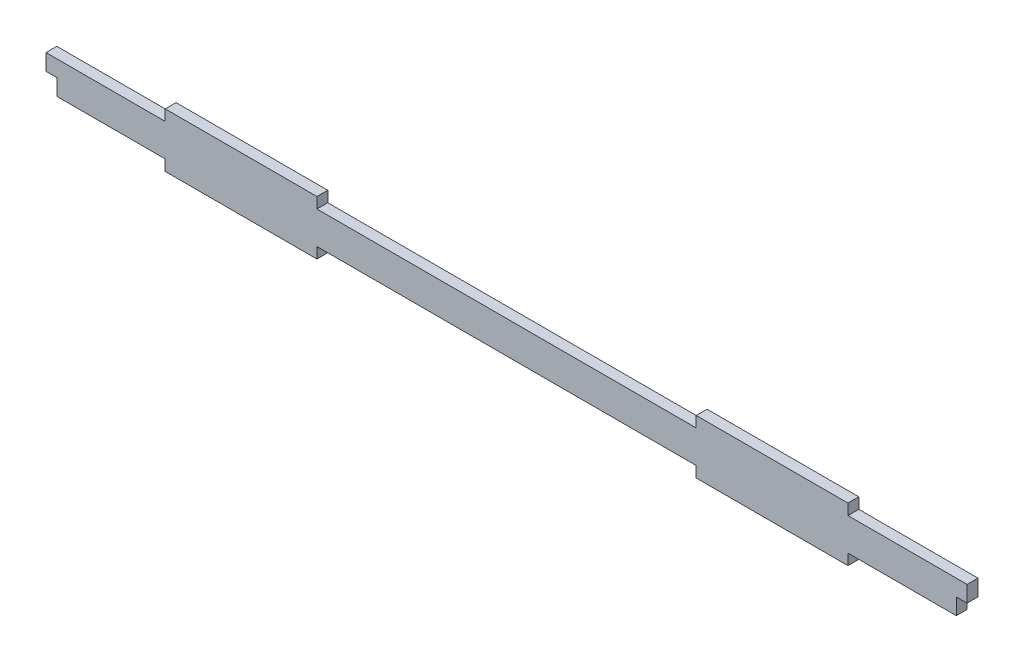
ISO-10303-21;
HEADER;
FILE_DESCRIPTION(('STEP AP214'),'2;1');
FILE_NAME('part.step','',(''),(''),'','','');
FILE_SCHEMA(('AUTOMOTIVE_DESIGN { 1 0 10303 214 1 1 1 1 }'));
ENDSEC;
DATA;
#1=APPLICATION_CONTEXT('core data for automotive mechanical design processes');
#2=APPLICATION_PROTOCOL_DEFINITION('international standard','automotive_design',2000,#1);
#3=PRODUCT_CONTEXT('',#1,'mechanical');
#4=PRODUCT('Part','Part','',(#3));
#5=PRODUCT_RELATED_PRODUCT_CATEGORY('part','',(#4));
#6=PRODUCT_DEFINITION_FORMATION('','',#4);
#7=PRODUCT_DEFINITION_CONTEXT('part definition',#1,'design');
#8=PRODUCT_DEFINITION('design','',#6,#7);
#9=PRODUCT_DEFINITION_SHAPE('','',#8);
#10=(LENGTH_UNIT() NAMED_UNIT(*) SI_UNIT(.MILLI.,.METRE.));
#11=(NAMED_UNIT(*) PLANE_ANGLE_UNIT() SI_UNIT($,.RADIAN.));
#12=(NAMED_UNIT(*) SI_UNIT($,.STERADIAN.) SOLID_ANGLE_UNIT());
#13=UNCERTAINTY_MEASURE_WITH_UNIT(LENGTH_MEASURE(1.E-05),#10,'distance_accuracy_value','');
#14=(GEOMETRIC_REPRESENTATION_CONTEXT(3) GLOBAL_UNCERTAINTY_ASSIGNED_CONTEXT((#13)) GLOBAL_UNIT_ASSIGNED_CONTEXT((#10,
#11,#12)) REPRESENTATION_CONTEXT('',''));
#15=CARTESIAN_POINT('',(0.,0.,0.));
#16=DIRECTION('',(0.,0.,1.));
#17=DIRECTION('',(1.,0.,0.));
#18=AXIS2_PLACEMENT_3D('',#15,#16,#17);
#19=CARTESIAN_POINT('',(0.,0.,5.));
#20=DIRECTION('',(0.,1.,0.));
#21=DIRECTION('',(-1.,0.,0.));
#22=AXIS2_PLACEMENT_3D('',#19,#20,#21);
#23=PLANE('',#22);
#24=DIRECTION('',(1.,0.,0.));
#25=VECTOR('',#24,1.);
#26=CARTESIAN_POINT('',(0.,0.,5.));
#27=LINE('',#26,#25);
#28=CARTESIAN_POINT('',(-50.,0.,5.));
#29=VERTEX_POINT('',#28);
#30=CARTESIAN_POINT('',(0.,0.,5.));
#31=VERTEX_POINT('',#30);
#32=EDGE_CURVE('E47',#29,#31,#27,.T.);
#33=ORIENTED_EDGE('',*,*,#32,.F.);
#34=DIRECTION('',(0.,0.,1.));
#35=VECTOR('',#34,1.);
#36=CARTESIAN_POINT('',(-50.,-1.04083408558608E-13,0.));
#37=LINE('',#36,#35);
#38=CARTESIAN_POINT('',(-50.,-1.04083408558608E-13,0.));
#39=VERTEX_POINT('',#38);
#40=EDGE_CURVE('E227',#39,#29,#37,.T.);
#41=ORIENTED_EDGE('',*,*,#40,.F.);
#42=DIRECTION('',(1.,0.,0.));
#43=VECTOR('',#42,1.);
#44=CARTESIAN_POINT('',(0.,0.,0.));
#45=LINE('',#44,#43);
#46=CARTESIAN_POINT('',(0.,0.,0.));
#47=VERTEX_POINT('',#46);
#48=EDGE_CURVE('E374',#39,#47,#45,.T.);
#49=ORIENTED_EDGE('',*,*,#48,.T.);
#50=DIRECTION('',(0.,0.,-1.));
#51=VECTOR('',#50,1.);
#52=CARTESIAN_POINT('',(0.,0.,5.));
#53=LINE('',#52,#51);
#54=EDGE_CURVE('E40',#31,#47,#53,.T.);
#55=ORIENTED_EDGE('',*,*,#54,.F.);
#56=EDGE_LOOP('',(#33,#41,#49,#55));
#57=FACE_BOUND('',#56,.T.);
#58=ADVANCED_FACE('F32',(#57),#23,.F.);
#59=CARTESIAN_POINT('',(-295.,-1.04083408558608E-13,0.));
#60=VERTEX_POINT('',#59);
#61=CARTESIAN_POINT('',(-120.,0.,0.));
#62=VERTEX_POINT('',#61);
#63=EDGE_CURVE('E376',#60,#62,#45,.T.);
#64=ORIENTED_EDGE('',*,*,#63,.T.);
#65=DIRECTION('',(0.,0.,1.));
#66=VECTOR('',#65,1.);
#67=CARTESIAN_POINT('',(-120.,-1.04083408558608E-13,0.));
#68=LINE('',#67,#66);
#69=CARTESIAN_POINT('',(-120.,0.,5.));
#70=VERTEX_POINT('',#69);
#71=EDGE_CURVE('E55',#62,#70,#68,.T.);
#72=ORIENTED_EDGE('',*,*,#71,.T.);
#73=CARTESIAN_POINT('',(-295.,-1.04083408558608E-13,5.));
#74=VERTEX_POINT('',#73);
#75=EDGE_CURVE('E365',#74,#70,#27,.T.);
#76=ORIENTED_EDGE('',*,*,#75,.F.);
#77=DIRECTION('',(0.,0.,1.));
#78=VECTOR('',#77,1.);
#79=CARTESIAN_POINT('',(-295.,-1.04083408558608E-13,0.));
#80=LINE('',#79,#78);
#81=EDGE_CURVE('E253',#60,#74,#80,.T.);
#82=ORIENTED_EDGE('',*,*,#81,.F.);
#83=EDGE_LOOP('',(#64,#72,#76,#82));
#84=FACE_BOUND('',#83,.T.);
#85=ADVANCED_FACE('F390',(#84),#23,.F.);
#86=CARTESIAN_POINT('',(0.,15.,5.));
#87=DIRECTION('',(0.,-1.,0.));
#88=DIRECTION('',(1.,0.,0.));
#89=AXIS2_PLACEMENT_3D('',#86,#87,#88);
#90=PLANE('',#89);
#91=DIRECTION('',(-1.,0.,0.));
#92=VECTOR('',#91,1.);
#93=CARTESIAN_POINT('',(0.,15.,0.));
#94=LINE('',#93,#92);
#95=CARTESIAN_POINT('',(5.,14.9999999999999,0.));
#96=VERTEX_POINT('',#95);
#97=CARTESIAN_POINT('',(-50.,15.,0.));
#98=VERTEX_POINT('',#97);
#99=EDGE_CURVE('E369',#96,#98,#94,.T.);
#100=ORIENTED_EDGE('',*,*,#99,.T.);
#101=DIRECTION('',(0.,0.,1.));
#102=VECTOR('',#101,1.);
#103=CARTESIAN_POINT('',(-50.,15.,0.));
#104=LINE('',#103,#102);
#105=CARTESIAN_POINT('',(-50.,15.,5.));
#106=VERTEX_POINT('',#105);
#107=EDGE_CURVE('E276',#98,#106,#104,.T.);
#108=ORIENTED_EDGE('',*,*,#107,.T.);
#109=DIRECTION('',(-1.,0.,0.));
#110=VECTOR('',#109,1.);
#111=CARTESIAN_POINT('',(0.,15.,5.));
#112=LINE('',#111,#110);
#113=CARTESIAN_POINT('',(5.,14.9999999999999,5.));
#114=VERTEX_POINT('',#113);
#115=EDGE_CURVE('E356',#114,#106,#112,.T.);
#116=ORIENTED_EDGE('',*,*,#115,.F.);
#117=DIRECTION('',(0.,0.,1.));
#118=VECTOR('',#117,1.);
#119=CARTESIAN_POINT('',(5.,14.9999999999999,0.));
#120=LINE('',#119,#118);
#121=EDGE_CURVE('E323',#96,#114,#120,.T.);
#122=ORIENTED_EDGE('',*,*,#121,.F.);
#123=EDGE_LOOP('',(#100,#108,#116,#122));
#124=FACE_BOUND('',#123,.T.);
#125=ADVANCED_FACE('F413',(#124),#90,.F.);
#126=DIRECTION('',(0.,0.,1.));
#127=VECTOR('',#126,1.);
#128=CARTESIAN_POINT('',(-365.,15.,0.));
#129=LINE('',#128,#127);
#130=CARTESIAN_POINT('',(-365.,15.,0.));
#131=VERTEX_POINT('',#130);
#132=CARTESIAN_POINT('',(-365.,15.,5.));
#133=VERTEX_POINT('',#132);
#134=EDGE_CURVE('E294',#131,#133,#129,.T.);
#135=ORIENTED_EDGE('',*,*,#134,.F.);
#136=CARTESIAN_POINT('',(-420.,14.9999999999999,0.));
#137=VERTEX_POINT('',#136);
#138=EDGE_CURVE('E368',#131,#137,#94,.T.);
#139=ORIENTED_EDGE('',*,*,#138,.T.);
#140=DIRECTION('',(0.,0.,1.));
#141=VECTOR('',#140,1.);
#142=CARTESIAN_POINT('',(-420.,14.9999999999999,0.));
#143=LINE('',#142,#141);
#144=CARTESIAN_POINT('',(-420.,14.9999999999999,5.));
#145=VERTEX_POINT('',#144);
#146=EDGE_CURVE('E338',#137,#145,#143,.T.);
#147=ORIENTED_EDGE('',*,*,#146,.T.);
#148=EDGE_CURVE('E354',#133,#145,#112,.T.);
#149=ORIENTED_EDGE('',*,*,#148,.F.);
#150=EDGE_LOOP('',(#135,#139,#147,#149));
#151=FACE_BOUND('',#150,.T.);
#152=ADVANCED_FACE('F425',(#151),#90,.F.);
#153=CARTESIAN_POINT('',(-415.,0.,5.));
#154=DIRECTION('',(1.,0.,0.));
#155=DIRECTION('',(0.,0.,-1.));
#156=AXIS2_PLACEMENT_3D('',#153,#154,#155);
#157=PLANE('',#156);
#158=DIRECTION('',(0.,0.,1.));
#159=VECTOR('',#158,1.);
#160=CARTESIAN_POINT('',(-415.,7.49999999999995,0.));
#161=LINE('',#160,#159);
#162=CARTESIAN_POINT('',(-415.,7.49999999999995,0.));
#163=VERTEX_POINT('',#162);
#164=CARTESIAN_POINT('',(-415.,7.49999999999995,5.));
#165=VERTEX_POINT('',#164);
#166=EDGE_CURVE('E343',#163,#165,#161,.T.);
#167=ORIENTED_EDGE('',*,*,#166,.F.);
#168=DIRECTION('',(0.,-1.,0.));
#169=VECTOR('',#168,1.);
#170=CARTESIAN_POINT('',(-415.,0.,0.));
#171=LINE('',#170,#169);
#172=CARTESIAN_POINT('',(-415.,0.,0.));
#173=VERTEX_POINT('',#172);
#174=EDGE_CURVE('E371',#163,#173,#171,.T.);
#175=ORIENTED_EDGE('',*,*,#174,.T.);
#176=DIRECTION('',(0.,0.,-1.));
#177=VECTOR('',#176,1.);
#178=CARTESIAN_POINT('',(-415.,0.,5.));
#179=LINE('',#178,#177);
#180=CARTESIAN_POINT('',(-415.,0.,5.));
#181=VERTEX_POINT('',#180);
#182=EDGE_CURVE('E11',#181,#173,#179,.T.);
#183=ORIENTED_EDGE('',*,*,#182,.F.);
#184=DIRECTION('',(0.,-1.,0.));
#185=VECTOR('',#184,1.);
#186=CARTESIAN_POINT('',(-415.,0.,5.));
#187=LINE('',#186,#185);
#188=EDGE_CURVE('E359',#165,#181,#187,.T.);
#189=ORIENTED_EDGE('',*,*,#188,.F.);
#190=EDGE_LOOP('',(#167,#175,#183,#189));
#191=FACE_BOUND('',#190,.T.);
#192=ADVANCED_FACE('F437',(#191),#157,.F.);
#193=CARTESIAN_POINT('',(0.,0.,5.));
#194=DIRECTION('',(-1.,0.,0.));
#195=DIRECTION('',(0.,0.,1.));
#196=AXIS2_PLACEMENT_3D('',#193,#194,#195);
#197=PLANE('',#196);
#198=DIRECTION('',(0.,1.,0.));
#199=VECTOR('',#198,1.);
#200=CARTESIAN_POINT('',(0.,0.,0.));
#201=LINE('',#200,#199);
#202=CARTESIAN_POINT('',(0.,7.49999999999995,0.));
#203=VERTEX_POINT('',#202);
#204=EDGE_CURVE('E346',#47,#203,#201,.T.);
#205=ORIENTED_EDGE('',*,*,#204,.T.);
#206=DIRECTION('',(0.,0.,1.));
#207=VECTOR('',#206,1.);
#208=CARTESIAN_POINT('',(0.,7.49999999999995,0.));
#209=LINE('',#208,#207);
#210=CARTESIAN_POINT('',(0.,7.49999999999995,5.));
#211=VERTEX_POINT('',#210);
#212=EDGE_CURVE('E318',#203,#211,#209,.T.);
#213=ORIENTED_EDGE('',*,*,#212,.T.);
#214=DIRECTION('',(0.,1.,0.));
#215=VECTOR('',#214,1.);
#216=CARTESIAN_POINT('',(0.,0.,5.));
#217=LINE('',#216,#215);
#218=EDGE_CURVE('E351',#31,#211,#217,.T.);
#219=ORIENTED_EDGE('',*,*,#218,.F.);
#220=ORIENTED_EDGE('',*,*,#54,.T.);
#221=EDGE_LOOP('',(#205,#213,#219,#220));
#222=FACE_BOUND('',#221,.T.);
#223=ADVANCED_FACE('F34',(#222),#197,.F.);
#224=CARTESIAN_POINT('',(-120.,15.,5.));
#225=VERTEX_POINT('',#224);
#226=CARTESIAN_POINT('',(-295.,15.,5.));
#227=VERTEX_POINT('',#226);
#228=EDGE_CURVE('E360',#225,#227,#112,.T.);
#229=ORIENTED_EDGE('',*,*,#228,.F.);
#230=DIRECTION('',(0.,0.,1.));
#231=VECTOR('',#230,1.);
#232=CARTESIAN_POINT('',(-120.,15.,0.));
#233=LINE('',#232,#231);
#234=CARTESIAN_POINT('',(-120.,15.,0.));
#235=VERTEX_POINT('',#234);
#236=EDGE_CURVE('E279',#235,#225,#233,.T.);
#237=ORIENTED_EDGE('',*,*,#236,.F.);
#238=CARTESIAN_POINT('',(-295.,15.,0.));
#239=VERTEX_POINT('',#238);
#240=EDGE_CURVE('E372',#235,#239,#94,.T.);
#241=ORIENTED_EDGE('',*,*,#240,.T.);
#242=DIRECTION('',(0.,0.,1.));
#243=VECTOR('',#242,1.);
#244=CARTESIAN_POINT('',(-295.,15.,0.));
#245=LINE('',#244,#243);
#246=EDGE_CURVE('E307',#239,#227,#245,.T.);
#247=ORIENTED_EDGE('',*,*,#246,.T.);
#248=EDGE_LOOP('',(#229,#237,#241,#247));
#249=FACE_BOUND('',#248,.T.);
#250=ADVANCED_FACE('F417',(#249),#90,.F.);
#251=CARTESIAN_POINT('',(-365.,-1.04083408558608E-13,0.));
#252=VERTEX_POINT('',#251);
#253=EDGE_CURVE('E355',#173,#252,#45,.T.);
#254=ORIENTED_EDGE('',*,*,#253,.T.);
#255=DIRECTION('',(0.,0.,1.));
#256=VECTOR('',#255,1.);
#257=CARTESIAN_POINT('',(-365.,-1.04083408558608E-13,0.));
#258=LINE('',#257,#256);
#259=CARTESIAN_POINT('',(-365.,0.,5.));
#260=VERTEX_POINT('',#259);
#261=EDGE_CURVE('E249',#252,#260,#258,.T.);
#262=ORIENTED_EDGE('',*,*,#261,.T.);
#263=EDGE_CURVE('E362',#181,#260,#27,.T.);
#264=ORIENTED_EDGE('',*,*,#263,.F.);
#265=ORIENTED_EDGE('',*,*,#182,.T.);
#266=EDGE_LOOP('',(#254,#262,#264,#265));
#267=FACE_BOUND('',#266,.T.);
#268=ADVANCED_FACE('F409',(#267),#23,.F.);
#269=CARTESIAN_POINT('',(0.,0.,5.));
#270=DIRECTION('',(0.,0.,1.));
#271=DIRECTION('',(1.,0.,0.));
#272=AXIS2_PLACEMENT_3D('',#269,#270,#271);
#273=PLANE('',#272);
#274=ORIENTED_EDGE('',*,*,#218,.T.);
#275=DIRECTION('',(1.,0.,0.));
#276=VECTOR('',#275,1.);
#277=CARTESIAN_POINT('',(0.,7.49999999999995,5.));
#278=LINE('',#277,#276);
#279=CARTESIAN_POINT('',(5.,7.49999999999995,5.));
#280=VERTEX_POINT('',#279);
#281=EDGE_CURVE('E304',#211,#280,#278,.T.);
#282=ORIENTED_EDGE('',*,*,#281,.T.);
#283=DIRECTION('',(0.,1.,0.));
#284=VECTOR('',#283,1.);
#285=CARTESIAN_POINT('',(5.,14.9999999999999,5.));
#286=LINE('',#285,#284);
#287=EDGE_CURVE('E315',#280,#114,#286,.T.);
#288=ORIENTED_EDGE('',*,*,#287,.T.);
#289=ORIENTED_EDGE('',*,*,#115,.T.);
#290=DIRECTION('',(0.,1.,0.));
#291=VECTOR('',#290,1.);
#292=CARTESIAN_POINT('',(-50.,15.,5.));
#293=LINE('',#292,#291);
#294=CARTESIAN_POINT('',(-50.,20.,5.));
#295=VERTEX_POINT('',#294);
#296=EDGE_CURVE('E252',#106,#295,#293,.T.);
#297=ORIENTED_EDGE('',*,*,#296,.T.);
#298=DIRECTION('',(-1.,0.,0.));
#299=VECTOR('',#298,1.);
#300=CARTESIAN_POINT('',(-50.,20.,5.));
#301=LINE('',#300,#299);
#302=CARTESIAN_POINT('',(-120.,20.,5.));
#303=VERTEX_POINT('',#302);
#304=EDGE_CURVE('E271',#295,#303,#301,.T.);
#305=ORIENTED_EDGE('',*,*,#304,.T.);
#306=DIRECTION('',(0.,-1.,0.));
#307=VECTOR('',#306,1.);
#308=CARTESIAN_POINT('',(-120.,15.,5.));
#309=LINE('',#308,#307);
#310=EDGE_CURVE('E262',#303,#225,#309,.T.);
#311=ORIENTED_EDGE('',*,*,#310,.T.);
#312=ORIENTED_EDGE('',*,*,#228,.T.);
#313=DIRECTION('',(0.,1.,0.));
#314=VECTOR('',#313,1.);
#315=CARTESIAN_POINT('',(-295.,15.,5.));
#316=LINE('',#315,#314);
#317=CARTESIAN_POINT('',(-295.,20.,5.));
#318=VERTEX_POINT('',#317);
#319=EDGE_CURVE('E297',#227,#318,#316,.T.);
#320=ORIENTED_EDGE('',*,*,#319,.T.);
#321=DIRECTION('',(-1.,0.,0.));
#322=VECTOR('',#321,1.);
#323=CARTESIAN_POINT('',(-365.,20.,5.));
#324=LINE('',#323,#322);
#325=CARTESIAN_POINT('',(-365.,20.,5.));
#326=VERTEX_POINT('',#325);
#327=EDGE_CURVE('E288',#318,#326,#324,.T.);
#328=ORIENTED_EDGE('',*,*,#327,.T.);
#329=DIRECTION('',(0.,-1.,0.));
#330=VECTOR('',#329,1.);
#331=CARTESIAN_POINT('',(-365.,15.,5.));
#332=LINE('',#331,#330);
#333=EDGE_CURVE('E278',#326,#133,#332,.T.);
#334=ORIENTED_EDGE('',*,*,#333,.T.);
#335=ORIENTED_EDGE('',*,*,#148,.T.);
#336=DIRECTION('',(0.,-1.,0.));
#337=VECTOR('',#336,1.);
#338=CARTESIAN_POINT('',(-420.,14.9999999999999,5.));
#339=LINE('',#338,#337);
#340=CARTESIAN_POINT('',(-420.,7.49999999999995,5.));
#341=VERTEX_POINT('',#340);
#342=EDGE_CURVE('E326',#145,#341,#339,.T.);
#343=ORIENTED_EDGE('',*,*,#342,.T.);
#344=DIRECTION('',(1.,0.,0.));
#345=VECTOR('',#344,1.);
#346=CARTESIAN_POINT('',(-415.,7.49999999999995,5.));
#347=LINE('',#346,#345);
#348=EDGE_CURVE('E335',#341,#165,#347,.T.);
#349=ORIENTED_EDGE('',*,*,#348,.T.);
#350=ORIENTED_EDGE('',*,*,#188,.T.);
#351=ORIENTED_EDGE('',*,*,#263,.T.);
#352=DIRECTION('',(0.,-1.,0.));
#353=VECTOR('',#352,1.);
#354=CARTESIAN_POINT('',(-365.,-1.04083408558608E-13,5.));
#355=LINE('',#354,#353);
#356=CARTESIAN_POINT('',(-365.,-5.0000000000001,5.));
#357=VERTEX_POINT('',#356);
#358=EDGE_CURVE('E229',#260,#357,#355,.T.);
#359=ORIENTED_EDGE('',*,*,#358,.T.);
#360=DIRECTION('',(1.,0.,0.));
#361=VECTOR('',#360,1.);
#362=CARTESIAN_POINT('',(-365.,-5.0000000000001,5.));
#363=LINE('',#362,#361);
#364=CARTESIAN_POINT('',(-295.,-5.0000000000001,5.));
#365=VERTEX_POINT('',#364);
#366=EDGE_CURVE('E244',#357,#365,#363,.T.);
#367=ORIENTED_EDGE('',*,*,#366,.T.);
#368=DIRECTION('',(0.,1.,0.));
#369=VECTOR('',#368,1.);
#370=CARTESIAN_POINT('',(-295.,-1.04083408558608E-13,5.));
#371=LINE('',#370,#369);
#372=EDGE_CURVE('E236',#365,#74,#371,.T.);
#373=ORIENTED_EDGE('',*,*,#372,.T.);
#374=ORIENTED_EDGE('',*,*,#75,.T.);
#375=DIRECTION('',(0.,-1.,0.));
#376=VECTOR('',#375,1.);
#377=CARTESIAN_POINT('',(-120.,-1.04083408558608E-13,5.));
#378=LINE('',#377,#376);
#379=CARTESIAN_POINT('',(-120.,-5.0000000000001,5.));
#380=VERTEX_POINT('',#379);
#381=EDGE_CURVE('E224',#70,#380,#378,.T.);
#382=ORIENTED_EDGE('',*,*,#381,.T.);
#383=DIRECTION('',(1.,0.,0.));
#384=VECTOR('',#383,1.);
#385=CARTESIAN_POINT('',(-50.,-5.0000000000001,5.));
#386=LINE('',#385,#384);
#387=CARTESIAN_POINT('',(-50.,-5.0000000000001,5.));
#388=VERTEX_POINT('',#387);
#389=EDGE_CURVE('E201',#380,#388,#386,.T.);
#390=ORIENTED_EDGE('',*,*,#389,.T.);
#391=DIRECTION('',(0.,1.,0.));
#392=VECTOR('',#391,1.);
#393=CARTESIAN_POINT('',(-50.,-1.04083408558608E-13,5.));
#394=LINE('',#393,#392);
#395=EDGE_CURVE('E218',#388,#29,#394,.T.);
#396=ORIENTED_EDGE('',*,*,#395,.T.);
#397=ORIENTED_EDGE('',*,*,#32,.T.);
#398=EDGE_LOOP('',(#274,#282,#288,#289,#297,#305,#311,#312,#320,#328,#334,#335,#343,#349,#350,
#351,#359,#367,#373,#374,#382,#390,#396,#397));
#399=FACE_BOUND('',#398,.T.);
#400=ADVANCED_FACE('F385',(#399),#273,.T.);
#401=CARTESIAN_POINT('',(0.,0.,0.));
#402=DIRECTION('',(0.,0.,1.));
#403=DIRECTION('',(1.,0.,0.));
#404=AXIS2_PLACEMENT_3D('',#401,#402,#403);
#405=PLANE('',#404);
#406=ORIENTED_EDGE('',*,*,#204,.F.);
#407=ORIENTED_EDGE('',*,*,#48,.F.);
#408=DIRECTION('',(0.,1.,0.));
#409=VECTOR('',#408,1.);
#410=CARTESIAN_POINT('',(-50.,-1.04083408558608E-13,0.));
#411=LINE('',#410,#409);
#412=CARTESIAN_POINT('',(-50.,-5.0000000000001,0.));
#413=VERTEX_POINT('',#412);
#414=EDGE_CURVE('E215',#413,#39,#411,.T.);
#415=ORIENTED_EDGE('',*,*,#414,.F.);
#416=DIRECTION('',(1.,0.,0.));
#417=VECTOR('',#416,1.);
#418=CARTESIAN_POINT('',(-50.,-5.0000000000001,0.));
#419=LINE('',#418,#417);
#420=CARTESIAN_POINT('',(-120.,-5.0000000000001,0.));
#421=VERTEX_POINT('',#420);
#422=EDGE_CURVE('E198',#421,#413,#419,.T.);
#423=ORIENTED_EDGE('',*,*,#422,.F.);
#424=DIRECTION('',(0.,-1.,0.));
#425=VECTOR('',#424,1.);
#426=CARTESIAN_POINT('',(-120.,-1.04083408558608E-13,0.));
#427=LINE('',#426,#425);
#428=EDGE_CURVE('E213',#62,#421,#427,.T.);
#429=ORIENTED_EDGE('',*,*,#428,.F.);
#430=ORIENTED_EDGE('',*,*,#63,.F.);
#431=DIRECTION('',(0.,1.,0.));
#432=VECTOR('',#431,1.);
#433=CARTESIAN_POINT('',(-295.,-1.04083408558608E-13,0.));
#434=LINE('',#433,#432);
#435=CARTESIAN_POINT('',(-295.,-5.0000000000001,0.));
#436=VERTEX_POINT('',#435);
#437=EDGE_CURVE('E239',#436,#60,#434,.T.);
#438=ORIENTED_EDGE('',*,*,#437,.F.);
#439=DIRECTION('',(1.,0.,0.));
#440=VECTOR('',#439,1.);
#441=CARTESIAN_POINT('',(-365.,-5.0000000000001,0.));
#442=LINE('',#441,#440);
#443=CARTESIAN_POINT('',(-365.,-5.0000000000001,0.));
#444=VERTEX_POINT('',#443);
#445=EDGE_CURVE('E235',#444,#436,#442,.T.);
#446=ORIENTED_EDGE('',*,*,#445,.F.);
#447=DIRECTION('',(0.,-1.,0.));
#448=VECTOR('',#447,1.);
#449=CARTESIAN_POINT('',(-365.,-1.04083408558608E-13,0.));
#450=LINE('',#449,#448);
#451=EDGE_CURVE('E232',#252,#444,#450,.T.);
#452=ORIENTED_EDGE('',*,*,#451,.F.);
#453=ORIENTED_EDGE('',*,*,#253,.F.);
#454=ORIENTED_EDGE('',*,*,#174,.F.);
#455=DIRECTION('',(1.,0.,0.));
#456=VECTOR('',#455,1.);
#457=CARTESIAN_POINT('',(-415.,7.49999999999995,0.));
#458=LINE('',#457,#456);
#459=CARTESIAN_POINT('',(-420.,7.49999999999995,0.));
#460=VERTEX_POINT('',#459);
#461=EDGE_CURVE('E334',#460,#163,#458,.T.);
#462=ORIENTED_EDGE('',*,*,#461,.F.);
#463=DIRECTION('',(0.,-1.,0.));
#464=VECTOR('',#463,1.);
#465=CARTESIAN_POINT('',(-420.,14.9999999999999,0.));
#466=LINE('',#465,#464);
#467=EDGE_CURVE('E331',#137,#460,#466,.T.);
#468=ORIENTED_EDGE('',*,*,#467,.F.);
#469=ORIENTED_EDGE('',*,*,#138,.F.);
#470=DIRECTION('',(0.,-1.,0.));
#471=VECTOR('',#470,1.);
#472=CARTESIAN_POINT('',(-365.,15.,0.));
#473=LINE('',#472,#471);
#474=CARTESIAN_POINT('',(-365.,20.,0.));
#475=VERTEX_POINT('',#474);
#476=EDGE_CURVE('E285',#475,#131,#473,.T.);
#477=ORIENTED_EDGE('',*,*,#476,.F.);
#478=DIRECTION('',(-1.,0.,0.));
#479=VECTOR('',#478,1.);
#480=CARTESIAN_POINT('',(-365.,20.,0.));
#481=LINE('',#480,#479);
#482=CARTESIAN_POINT('',(-295.,20.,0.));
#483=VERTEX_POINT('',#482);
#484=EDGE_CURVE('E291',#483,#475,#481,.T.);
#485=ORIENTED_EDGE('',*,*,#484,.F.);
#486=DIRECTION('',(0.,1.,0.));
#487=VECTOR('',#486,1.);
#488=CARTESIAN_POINT('',(-295.,15.,0.));
#489=LINE('',#488,#487);
#490=EDGE_CURVE('E287',#239,#483,#489,.T.);
#491=ORIENTED_EDGE('',*,*,#490,.F.);
#492=ORIENTED_EDGE('',*,*,#240,.F.);
#493=DIRECTION('',(0.,-1.,0.));
#494=VECTOR('',#493,1.);
#495=CARTESIAN_POINT('',(-120.,15.,0.));
#496=LINE('',#495,#494);
#497=CARTESIAN_POINT('',(-120.,20.,0.));
#498=VERTEX_POINT('',#497);
#499=EDGE_CURVE('E265',#498,#235,#496,.T.);
#500=ORIENTED_EDGE('',*,*,#499,.F.);
#501=DIRECTION('',(-1.,0.,0.));
#502=VECTOR('',#501,1.);
#503=CARTESIAN_POINT('',(-50.,20.,0.));
#504=LINE('',#503,#502);
#505=CARTESIAN_POINT('',(-50.,20.,0.));
#506=VERTEX_POINT('',#505);
#507=EDGE_CURVE('E261',#506,#498,#504,.T.);
#508=ORIENTED_EDGE('',*,*,#507,.F.);
#509=DIRECTION('',(0.,1.,0.));
#510=VECTOR('',#509,1.);
#511=CARTESIAN_POINT('',(-50.,15.,0.));
#512=LINE('',#511,#510);
#513=EDGE_CURVE('E258',#98,#506,#512,.T.);
#514=ORIENTED_EDGE('',*,*,#513,.F.);
#515=ORIENTED_EDGE('',*,*,#99,.F.);
#516=DIRECTION('',(0.,1.,0.));
#517=VECTOR('',#516,1.);
#518=CARTESIAN_POINT('',(5.,14.9999999999999,0.));
#519=LINE('',#518,#517);
#520=CARTESIAN_POINT('',(5.,7.49999999999995,0.));
#521=VERTEX_POINT('',#520);
#522=EDGE_CURVE('E314',#521,#96,#519,.T.);
#523=ORIENTED_EDGE('',*,*,#522,.F.);
#524=DIRECTION('',(1.,0.,0.));
#525=VECTOR('',#524,1.);
#526=CARTESIAN_POINT('',(0.,7.49999999999995,0.));
#527=LINE('',#526,#525);
#528=EDGE_CURVE('E311',#203,#521,#527,.T.);
#529=ORIENTED_EDGE('',*,*,#528,.F.);
#530=EDGE_LOOP('',(#406,#407,#415,#423,#429,#430,#438,#446,#452,#453,#454,#462,#468,#469,#477,
#485,#491,#492,#500,#508,#514,#515,#523,#529));
#531=FACE_BOUND('',#530,.T.);
#532=ADVANCED_FACE('F211',(#531),#405,.F.);
#533=CARTESIAN_POINT('',(-415.,7.49999999999995,0.));
#534=DIRECTION('',(0.,-1.,0.));
#535=DIRECTION('',(1.,0.,0.));
#536=AXIS2_PLACEMENT_3D('',#533,#534,#535);
#537=PLANE('',#536);
#538=ORIENTED_EDGE('',*,*,#348,.F.);
#539=DIRECTION('',(0.,0.,1.));
#540=VECTOR('',#539,1.);
#541=CARTESIAN_POINT('',(-420.,7.49999999999995,0.));
#542=LINE('',#541,#540);
#543=EDGE_CURVE('E347',#460,#341,#542,.T.);
#544=ORIENTED_EDGE('',*,*,#543,.F.);
#545=ORIENTED_EDGE('',*,*,#461,.T.);
#546=ORIENTED_EDGE('',*,*,#166,.T.);
#547=EDGE_LOOP('',(#538,#544,#545,#546));
#548=FACE_BOUND('',#547,.T.);
#549=ADVANCED_FACE('F439',(#548),#537,.T.);
#550=CARTESIAN_POINT('',(-420.,14.9999999999999,0.));
#551=DIRECTION('',(-1.,0.,0.));
#552=DIRECTION('',(0.,0.,1.));
#553=AXIS2_PLACEMENT_3D('',#550,#551,#552);
#554=PLANE('',#553);
#555=ORIENTED_EDGE('',*,*,#342,.F.);
#556=ORIENTED_EDGE('',*,*,#146,.F.);
#557=ORIENTED_EDGE('',*,*,#467,.T.);
#558=ORIENTED_EDGE('',*,*,#543,.T.);
#559=EDGE_LOOP('',(#555,#556,#557,#558));
#560=FACE_BOUND('',#559,.T.);
#561=ADVANCED_FACE('F446',(#560),#554,.T.);
#562=CARTESIAN_POINT('',(5.,14.9999999999999,0.));
#563=DIRECTION('',(1.,0.,0.));
#564=DIRECTION('',(0.,0.,-1.));
#565=AXIS2_PLACEMENT_3D('',#562,#563,#564);
#566=PLANE('',#565);
#567=ORIENTED_EDGE('',*,*,#287,.F.);
#568=DIRECTION('',(0.,0.,1.));
#569=VECTOR('',#568,1.);
#570=CARTESIAN_POINT('',(5.,7.49999999999995,0.));
#571=LINE('',#570,#569);
#572=EDGE_CURVE('E327',#521,#280,#571,.T.);
#573=ORIENTED_EDGE('',*,*,#572,.F.);
#574=ORIENTED_EDGE('',*,*,#522,.T.);
#575=ORIENTED_EDGE('',*,*,#121,.T.);
#576=EDGE_LOOP('',(#567,#573,#574,#575));
#577=FACE_BOUND('',#576,.T.);
#578=ADVANCED_FACE('F472',(#577),#566,.T.);
#579=CARTESIAN_POINT('',(0.,7.49999999999995,0.));
#580=DIRECTION('',(0.,-1.,0.));
#581=DIRECTION('',(1.,0.,0.));
#582=AXIS2_PLACEMENT_3D('',#579,#580,#581);
#583=PLANE('',#582);
#584=ORIENTED_EDGE('',*,*,#281,.F.);
#585=ORIENTED_EDGE('',*,*,#212,.F.);
#586=ORIENTED_EDGE('',*,*,#528,.T.);
#587=ORIENTED_EDGE('',*,*,#572,.T.);
#588=EDGE_LOOP('',(#584,#585,#586,#587));
#589=FACE_BOUND('',#588,.T.);
#590=ADVANCED_FACE('F383',(#589),#583,.T.);
#591=CARTESIAN_POINT('',(-365.,15.,0.));
#592=DIRECTION('',(-1.,0.,0.));
#593=DIRECTION('',(0.,0.,1.));
#594=AXIS2_PLACEMENT_3D('',#591,#592,#593);
#595=PLANE('',#594);
#596=ORIENTED_EDGE('',*,*,#333,.F.);
#597=DIRECTION('',(0.,0.,1.));
#598=VECTOR('',#597,1.);
#599=CARTESIAN_POINT('',(-365.,20.,0.));
#600=LINE('',#599,#598);
#601=EDGE_CURVE('E302',#475,#326,#600,.T.);
#602=ORIENTED_EDGE('',*,*,#601,.F.);
#603=ORIENTED_EDGE('',*,*,#476,.T.);
#604=ORIENTED_EDGE('',*,*,#134,.T.);
#605=EDGE_LOOP('',(#596,#602,#603,#604));
#606=FACE_BOUND('',#605,.T.);
#607=ADVANCED_FACE('F464',(#606),#595,.T.);
#608=CARTESIAN_POINT('',(-365.,20.,0.));
#609=DIRECTION('',(0.,1.,0.));
#610=DIRECTION('',(0.,0.,1.));
#611=AXIS2_PLACEMENT_3D('',#608,#609,#610);
#612=PLANE('',#611);
#613=ORIENTED_EDGE('',*,*,#327,.F.);
#614=DIRECTION('',(0.,0.,1.));
#615=VECTOR('',#614,1.);
#616=CARTESIAN_POINT('',(-295.,20.,0.));
#617=LINE('',#616,#615);
#618=EDGE_CURVE('E305',#483,#318,#617,.T.);
#619=ORIENTED_EDGE('',*,*,#618,.F.);
#620=ORIENTED_EDGE('',*,*,#484,.T.);
#621=ORIENTED_EDGE('',*,*,#601,.T.);
#622=EDGE_LOOP('',(#613,#619,#620,#621));
#623=FACE_BOUND('',#622,.T.);
#624=ADVANCED_FACE('F460',(#623),#612,.T.);
#625=CARTESIAN_POINT('',(-295.,15.,0.));
#626=DIRECTION('',(1.,0.,0.));
#627=DIRECTION('',(0.,0.,-1.));
#628=AXIS2_PLACEMENT_3D('',#625,#626,#627);
#629=PLANE('',#628);
#630=ORIENTED_EDGE('',*,*,#319,.F.);
#631=ORIENTED_EDGE('',*,*,#246,.F.);
#632=ORIENTED_EDGE('',*,*,#490,.T.);
#633=ORIENTED_EDGE('',*,*,#618,.T.);
#634=EDGE_LOOP('',(#630,#631,#632,#633));
#635=FACE_BOUND('',#634,.T.);
#636=ADVANCED_FACE('F456',(#635),#629,.T.);
#637=CARTESIAN_POINT('',(-50.,15.,0.));
#638=DIRECTION('',(1.,0.,0.));
#639=DIRECTION('',(0.,0.,-1.));
#640=AXIS2_PLACEMENT_3D('',#637,#638,#639);
#641=PLANE('',#640);
#642=ORIENTED_EDGE('',*,*,#296,.F.);
#643=ORIENTED_EDGE('',*,*,#107,.F.);
#644=ORIENTED_EDGE('',*,*,#513,.T.);
#645=DIRECTION('',(0.,0.,1.));
#646=VECTOR('',#645,1.);
#647=CARTESIAN_POINT('',(-50.,20.,0.));
#648=LINE('',#647,#646);
#649=EDGE_CURVE('E268',#506,#295,#648,.T.);
#650=ORIENTED_EDGE('',*,*,#649,.T.);
#651=EDGE_LOOP('',(#642,#643,#644,#650));
#652=FACE_BOUND('',#651,.T.);
#653=ADVANCED_FACE('F522',(#652),#641,.T.);
#654=CARTESIAN_POINT('',(-120.,15.,0.));
#655=DIRECTION('',(-1.,0.,0.));
#656=DIRECTION('',(0.,0.,1.));
#657=AXIS2_PLACEMENT_3D('',#654,#655,#656);
#658=PLANE('',#657);
#659=ORIENTED_EDGE('',*,*,#310,.F.);
#660=DIRECTION('',(0.,0.,1.));
#661=VECTOR('',#660,1.);
#662=CARTESIAN_POINT('',(-120.,20.,0.));
#663=LINE('',#662,#661);
#664=EDGE_CURVE('E282',#498,#303,#663,.T.);
#665=ORIENTED_EDGE('',*,*,#664,.F.);
#666=ORIENTED_EDGE('',*,*,#499,.T.);
#667=ORIENTED_EDGE('',*,*,#236,.T.);
#668=EDGE_LOOP('',(#659,#665,#666,#667));
#669=FACE_BOUND('',#668,.T.);
#670=ADVANCED_FACE('F530',(#669),#658,.T.);
#671=CARTESIAN_POINT('',(-50.,20.,0.));
#672=DIRECTION('',(0.,1.,0.));
#673=DIRECTION('',(0.,0.,1.));
#674=AXIS2_PLACEMENT_3D('',#671,#672,#673);
#675=PLANE('',#674);
#676=ORIENTED_EDGE('',*,*,#304,.F.);
#677=ORIENTED_EDGE('',*,*,#649,.F.);
#678=ORIENTED_EDGE('',*,*,#507,.T.);
#679=ORIENTED_EDGE('',*,*,#664,.T.);
#680=EDGE_LOOP('',(#676,#677,#678,#679));
#681=FACE_BOUND('',#680,.T.);
#682=ADVANCED_FACE('F540',(#681),#675,.T.);
#683=CARTESIAN_POINT('',(-365.,-1.04083408558608E-13,0.));
#684=DIRECTION('',(-1.,0.,0.));
#685=DIRECTION('',(0.,0.,1.));
#686=AXIS2_PLACEMENT_3D('',#683,#684,#685);
#687=PLANE('',#686);
#688=ORIENTED_EDGE('',*,*,#358,.F.);
#689=ORIENTED_EDGE('',*,*,#261,.F.);
#690=ORIENTED_EDGE('',*,*,#451,.T.);
#691=DIRECTION('',(0.,0.,1.));
#692=VECTOR('',#691,1.);
#693=CARTESIAN_POINT('',(-365.,-5.0000000000001,0.));
#694=LINE('',#693,#692);
#695=EDGE_CURVE('E241',#444,#357,#694,.T.);
#696=ORIENTED_EDGE('',*,*,#695,.T.);
#697=EDGE_LOOP('',(#688,#689,#690,#696));
#698=FACE_BOUND('',#697,.T.);
#699=ADVANCED_FACE('F433',(#698),#687,.T.);
#700=CARTESIAN_POINT('',(-295.,-1.04083408558608E-13,0.));
#701=DIRECTION('',(1.,0.,0.));
#702=DIRECTION('',(0.,0.,-1.));
#703=AXIS2_PLACEMENT_3D('',#700,#701,#702);
#704=PLANE('',#703);
#705=ORIENTED_EDGE('',*,*,#372,.F.);
#706=DIRECTION('',(0.,0.,1.));
#707=VECTOR('',#706,1.);
#708=CARTESIAN_POINT('',(-295.,-5.0000000000001,0.));
#709=LINE('',#708,#707);
#710=EDGE_CURVE('E255',#436,#365,#709,.T.);
#711=ORIENTED_EDGE('',*,*,#710,.F.);
#712=ORIENTED_EDGE('',*,*,#437,.T.);
#713=ORIENTED_EDGE('',*,*,#81,.T.);
#714=EDGE_LOOP('',(#705,#711,#712,#713));
#715=FACE_BOUND('',#714,.T.);
#716=ADVANCED_FACE('F404',(#715),#704,.T.);
#717=CARTESIAN_POINT('',(-365.,-5.0000000000001,0.));
#718=DIRECTION('',(0.,-1.,0.));
#719=DIRECTION('',(0.,0.,-1.));
#720=AXIS2_PLACEMENT_3D('',#717,#718,#719);
#721=PLANE('',#720);
#722=ORIENTED_EDGE('',*,*,#366,.F.);
#723=ORIENTED_EDGE('',*,*,#695,.F.);
#724=ORIENTED_EDGE('',*,*,#445,.T.);
#725=ORIENTED_EDGE('',*,*,#710,.T.);
#726=EDGE_LOOP('',(#722,#723,#724,#725));
#727=FACE_BOUND('',#726,.T.);
#728=ADVANCED_FACE('F397',(#727),#721,.T.);
#729=CARTESIAN_POINT('',(-50.,-1.04083408558608E-13,0.));
#730=DIRECTION('',(1.,0.,0.));
#731=DIRECTION('',(0.,0.,-1.));
#732=AXIS2_PLACEMENT_3D('',#729,#730,#731);
#733=PLANE('',#732);
#734=ORIENTED_EDGE('',*,*,#395,.F.);
#735=DIRECTION('',(0.,0.,1.));
#736=VECTOR('',#735,1.);
#737=CARTESIAN_POINT('',(-50.,-5.0000000000001,0.));
#738=LINE('',#737,#736);
#739=EDGE_CURVE('E206',#413,#388,#738,.T.);
#740=ORIENTED_EDGE('',*,*,#739,.F.);
#741=ORIENTED_EDGE('',*,*,#414,.T.);
#742=ORIENTED_EDGE('',*,*,#40,.T.);
#743=EDGE_LOOP('',(#734,#740,#741,#742));
#744=FACE_BOUND('',#743,.T.);
#745=ADVANCED_FACE('F395',(#744),#733,.T.);
#746=CARTESIAN_POINT('',(-50.,-5.0000000000001,0.));
#747=DIRECTION('',(0.,-1.,0.));
#748=DIRECTION('',(0.,0.,-1.));
#749=AXIS2_PLACEMENT_3D('',#746,#747,#748);
#750=PLANE('',#749);
#751=ORIENTED_EDGE('',*,*,#389,.F.);
#752=DIRECTION('',(0.,0.,1.));
#753=VECTOR('',#752,1.);
#754=CARTESIAN_POINT('',(-120.,-5.0000000000001,0.));
#755=LINE('',#754,#753);
#756=EDGE_CURVE('E195',#421,#380,#755,.T.);
#757=ORIENTED_EDGE('',*,*,#756,.F.);
#758=ORIENTED_EDGE('',*,*,#422,.T.);
#759=ORIENTED_EDGE('',*,*,#739,.T.);
#760=EDGE_LOOP('',(#751,#757,#758,#759));
#761=FACE_BOUND('',#760,.T.);
#762=ADVANCED_FACE('F197',(#761),#750,.T.);
#763=CARTESIAN_POINT('',(-120.,-1.04083408558608E-13,0.));
#764=DIRECTION('',(-1.,0.,0.));
#765=DIRECTION('',(0.,0.,1.));
#766=AXIS2_PLACEMENT_3D('',#763,#764,#765);
#767=PLANE('',#766);
#768=ORIENTED_EDGE('',*,*,#381,.F.);
#769=ORIENTED_EDGE('',*,*,#71,.F.);
#770=ORIENTED_EDGE('',*,*,#428,.T.);
#771=ORIENTED_EDGE('',*,*,#756,.T.);
#772=EDGE_LOOP('',(#768,#769,#770,#771));
#773=FACE_BOUND('',#772,.T.);
#774=ADVANCED_FACE('F217',(#773),#767,.T.);
#775=CLOSED_SHELL('',(#58,#85,#125,#152,#192,#223,#250,#268,#400,#532,#549,#561,#578,#590,#607,
#624,#636,#653,#670,#682,#699,#716,#728,#745,#762,#774));
#776=MANIFOLD_SOLID_BREP('B2',#775);
#777=ADVANCED_BREP_SHAPE_REPRESENTATION('',(#18,#776),#14);
#778=SHAPE_DEFINITION_REPRESENTATION(#9,#777);
ENDSEC;
END-ISO-10303-21;
